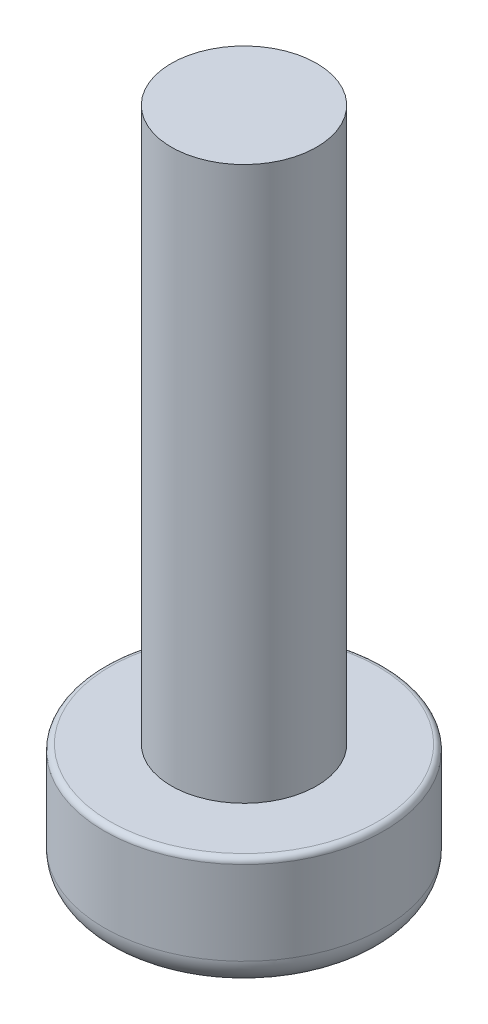
ISO-10303-21;
HEADER;
FILE_DESCRIPTION(('STEP AP214'),'2;1');
FILE_NAME('part.step','',(''),(''),'','','');
FILE_SCHEMA(('AUTOMOTIVE_DESIGN { 1 0 10303 214 1 1 1 1 }'));
ENDSEC;
DATA;
#1=APPLICATION_CONTEXT('core data for automotive mechanical design processes');
#2=APPLICATION_PROTOCOL_DEFINITION('international standard','automotive_design',2000,#1);
#3=PRODUCT_CONTEXT('',#1,'mechanical');
#4=PRODUCT('Part','Part','',(#3));
#5=PRODUCT_RELATED_PRODUCT_CATEGORY('part','',(#4));
#6=PRODUCT_DEFINITION_FORMATION('','',#4);
#7=PRODUCT_DEFINITION_CONTEXT('part definition',#1,'design');
#8=PRODUCT_DEFINITION('design','',#6,#7);
#9=PRODUCT_DEFINITION_SHAPE('','',#8);
#10=(LENGTH_UNIT() NAMED_UNIT(*) SI_UNIT(.MILLI.,.METRE.));
#11=(NAMED_UNIT(*) PLANE_ANGLE_UNIT() SI_UNIT($,.RADIAN.));
#12=(NAMED_UNIT(*) SI_UNIT($,.STERADIAN.) SOLID_ANGLE_UNIT());
#13=UNCERTAINTY_MEASURE_WITH_UNIT(LENGTH_MEASURE(1.E-05),#10,'distance_accuracy_value','');
#14=(GEOMETRIC_REPRESENTATION_CONTEXT(3) GLOBAL_UNCERTAINTY_ASSIGNED_CONTEXT((#13)) GLOBAL_UNIT_ASSIGNED_CONTEXT((#10,
#11,#12)) REPRESENTATION_CONTEXT('',''));
#15=CARTESIAN_POINT('',(0.,0.,0.));
#16=DIRECTION('',(0.,0.,1.));
#17=DIRECTION('',(1.,0.,0.));
#18=AXIS2_PLACEMENT_3D('',#15,#16,#17);
#19=CARTESIAN_POINT('',(0.700775596816466,0.0174321582535849,-0.498474883772021));
#20=DIRECTION('',(0.69906504089404,0.122790460952159,-0.704436350069309));
#21=DIRECTION('',(-0.70980773584202,0.,-0.704395469987439));
#22=AXIS2_PLACEMENT_3D('',#19,#20,#21);
#23=PLANE('',#22);
#24=DIRECTION('',(0.0868265938642476,-0.992432509138967,-0.0868265938642476));
#25=VECTOR('',#24,1.);
#26=CARTESIAN_POINT('',(0.368767004711114,1.5,-0.569525179986132));
#27=LINE('',#26,#25);
#28=CARTESIAN_POINT('',(0.368767004711114,1.5,-0.569525179986132));
#29=VERTEX_POINT('',#28);
#30=CARTESIAN_POINT('',(0.5,0.,-0.700758175275018));
#31=VERTEX_POINT('',#30);
#32=EDGE_CURVE('E168',#29,#31,#27,.T.);
#33=ORIENTED_EDGE('',*,*,#32,.T.);
#34=DIRECTION('',(-0.70980773584202,0.,-0.704395469987439));
#35=VECTOR('',#34,1.);
#36=CARTESIAN_POINT('',(0.702294854053973,0.,-0.500005814315819));
#37=LINE('',#36,#35);
#38=CARTESIAN_POINT('',(0.702300713044445,0.,-0.5));
#39=VERTEX_POINT('',#38);
#40=EDGE_CURVE('E187',#39,#31,#37,.T.);
#41=ORIENTED_EDGE('',*,*,#40,.F.);
#42=DIRECTION('',(-0.0868265938642478,0.992432509138967,0.0868265938642476));
#43=VECTOR('',#42,1.);
#44=CARTESIAN_POINT('',(0.702300713044445,0.,-0.5));
#45=LINE('',#44,#43);
#46=CARTESIAN_POINT('',(0.571067717755559,1.5,-0.368767004711114));
#47=VERTEX_POINT('',#46);
#48=EDGE_CURVE('E170',#39,#47,#45,.T.);
#49=ORIENTED_EDGE('',*,*,#48,.T.);
#50=DIRECTION('',(0.709807735842019,0.,0.70439546998744));
#51=VECTOR('',#50,1.);
#52=CARTESIAN_POINT('',(0.368767004711114,1.5,-0.569525179986132));
#53=LINE('',#52,#51);
#54=EDGE_CURVE('E139',#29,#47,#53,.T.);
#55=ORIENTED_EDGE('',*,*,#54,.F.);
#56=EDGE_LOOP('',(#33,#41,#49,#55));
#57=FACE_BOUND('',#56,.T.);
#58=ADVANCED_FACE('F15',(#57),#23,.F.);
#59=CARTESIAN_POINT('',(0.506013741174089,-0.0687373761551004,0.708314454218533));
#60=DIRECTION('',(0.704436350069309,0.122790460952159,0.69906504089404));
#61=DIRECTION('',(0.70439546998744,0.,-0.70980773584202));
#62=AXIS2_PLACEMENT_3D('',#59,#60,#61);
#63=PLANE('',#62);
#64=DIRECTION('',(0.0868265938642475,-0.992432509138967,0.0868265938642476));
#65=VECTOR('',#64,1.);
#66=CARTESIAN_POINT('',(0.569525179986132,1.5,0.368767004711114));
#67=LINE('',#66,#65);
#68=CARTESIAN_POINT('',(0.569525179986132,1.5,0.368767004711114));
#69=VERTEX_POINT('',#68);
#70=CARTESIAN_POINT('',(0.700758175275018,0.,0.5));
#71=VERTEX_POINT('',#70);
#72=EDGE_CURVE('E295',#69,#71,#67,.T.);
#73=ORIENTED_EDGE('',*,*,#72,.T.);
#74=DIRECTION('',(0.70439546998744,0.,-0.70980773584202));
#75=VECTOR('',#74,1.);
#76=CARTESIAN_POINT('',(0.499977073360182,0.,0.702323815842508));
#77=LINE('',#76,#75);
#78=CARTESIAN_POINT('',(0.5,0.,0.702300713044445));
#79=VERTEX_POINT('',#78);
#80=EDGE_CURVE('E185',#79,#71,#77,.T.);
#81=ORIENTED_EDGE('',*,*,#80,.F.);
#82=DIRECTION('',(-0.0868265938642476,0.992432509138967,-0.0868265938642473));
#83=VECTOR('',#82,1.);
#84=CARTESIAN_POINT('',(0.5,0.,0.702300713044445));
#85=LINE('',#84,#83);
#86=CARTESIAN_POINT('',(0.368767004711114,1.5,0.571067717755559));
#87=VERTEX_POINT('',#86);
#88=EDGE_CURVE('E293',#79,#87,#85,.T.);
#89=ORIENTED_EDGE('',*,*,#88,.T.);
#90=DIRECTION('',(-0.704395469987439,0.,0.70980773584202));
#91=VECTOR('',#90,1.);
#92=CARTESIAN_POINT('',(0.569525179986132,1.5,0.368767004711114));
#93=LINE('',#92,#91);
#94=EDGE_CURVE('E175',#69,#87,#93,.T.);
#95=ORIENTED_EDGE('',*,*,#94,.F.);
#96=EDGE_LOOP('',(#73,#81,#89,#95));
#97=FACE_BOUND('',#96,.T.);
#98=ADVANCED_FACE('F331',(#97),#63,.F.);
#99=CARTESIAN_POINT('',(-0.708314454218531,-0.0687373761551006,0.506013741174088));
#100=DIRECTION('',(-0.699065040894043,0.122790460952159,0.704436350069306));
#101=DIRECTION('',(0.709807735842017,0.,0.704395469987442));
#102=AXIS2_PLACEMENT_3D('',#99,#100,#101);
#103=PLANE('',#102);
#104=DIRECTION('',(-0.0868265938642476,-0.992432509138967,0.0868265938642477));
#105=VECTOR('',#104,1.);
#106=CARTESIAN_POINT('',(-0.368767004711114,1.5,0.569525179986132));
#107=LINE('',#106,#105);
#108=CARTESIAN_POINT('',(-0.368767004711114,1.5,0.569525179986131));
#109=VERTEX_POINT('',#108);
#110=CARTESIAN_POINT('',(-0.5,0.,0.700758175275018));
#111=VERTEX_POINT('',#110);
#112=EDGE_CURVE('E277',#109,#111,#107,.T.);
#113=ORIENTED_EDGE('',*,*,#112,.T.);
#114=DIRECTION('',(0.709807735842017,0.,0.704395469987442));
#115=VECTOR('',#114,1.);
#116=CARTESIAN_POINT('',(-0.702323815842506,0.,0.499977073360182));
#117=LINE('',#116,#115);
#118=CARTESIAN_POINT('',(-0.702300713044443,0.,0.5));
#119=VERTEX_POINT('',#118);
#120=EDGE_CURVE('E183',#119,#111,#117,.T.);
#121=ORIENTED_EDGE('',*,*,#120,.F.);
#122=DIRECTION('',(0.0868265938642478,0.992432509138967,-0.0868265938642476));
#123=VECTOR('',#122,1.);
#124=CARTESIAN_POINT('',(-0.702300713044443,0.,0.5));
#125=LINE('',#124,#123);
#126=CARTESIAN_POINT('',(-0.571067717755557,1.5,0.368767004711114));
#127=VERTEX_POINT('',#126);
#128=EDGE_CURVE('E275',#119,#127,#125,.T.);
#129=ORIENTED_EDGE('',*,*,#128,.T.);
#130=DIRECTION('',(-0.709807735842018,0.,-0.704395469987442));
#131=VECTOR('',#130,1.);
#132=CARTESIAN_POINT('',(-0.368767004711114,1.5,0.569525179986132));
#133=LINE('',#132,#131);
#134=EDGE_CURVE('E157',#109,#127,#133,.T.);
#135=ORIENTED_EDGE('',*,*,#134,.F.);
#136=EDGE_LOOP('',(#113,#121,#129,#135));
#137=FACE_BOUND('',#136,.T.);
#138=ADVANCED_FACE('F382',(#137),#103,.F.);
#139=CARTESIAN_POINT('',(-0.498474883772021,0.0174321582535849,-0.700775596816466));
#140=DIRECTION('',(-0.704436350069309,0.122790460952159,-0.69906504089404));
#141=DIRECTION('',(-0.70439546998744,0.,0.70980773584202));
#142=AXIS2_PLACEMENT_3D('',#139,#140,#141);
#143=PLANE('',#142);
#144=DIRECTION('',(-0.0868265938642476,-0.992432509138967,-0.0868265938642476));
#145=VECTOR('',#144,1.);
#146=CARTESIAN_POINT('',(-0.569525179986132,1.5,-0.368767004711114));
#147=LINE('',#146,#145);
#148=CARTESIAN_POINT('',(-0.569525179986132,1.5,-0.368767004711114));
#149=VERTEX_POINT('',#148);
#150=CARTESIAN_POINT('',(-0.700758175275018,0.,-0.5));
#151=VERTEX_POINT('',#150);
#152=EDGE_CURVE('E259',#149,#151,#147,.T.);
#153=ORIENTED_EDGE('',*,*,#152,.T.);
#154=DIRECTION('',(-0.70439546998744,0.,0.70980773584202));
#155=VECTOR('',#154,1.);
#156=CARTESIAN_POINT('',(-0.500005814315819,0.,-0.702294854053973));
#157=LINE('',#156,#155);
#158=CARTESIAN_POINT('',(-0.5,0.,-0.702300713044445));
#159=VERTEX_POINT('',#158);
#160=EDGE_CURVE('E181',#159,#151,#157,.T.);
#161=ORIENTED_EDGE('',*,*,#160,.F.);
#162=DIRECTION('',(0.0868265938642476,0.992432509138967,0.0868265938642476));
#163=VECTOR('',#162,1.);
#164=CARTESIAN_POINT('',(-0.5,0.,-0.702300713044445));
#165=LINE('',#164,#163);
#166=CARTESIAN_POINT('',(-0.368767004711114,1.5,-0.571067717755559));
#167=VERTEX_POINT('',#166);
#168=EDGE_CURVE('E255',#159,#167,#165,.T.);
#169=ORIENTED_EDGE('',*,*,#168,.T.);
#170=DIRECTION('',(0.704395469987439,0.,-0.70980773584202));
#171=VECTOR('',#170,1.);
#172=CARTESIAN_POINT('',(-0.569525179986132,1.5,-0.368767004711114));
#173=LINE('',#172,#171);
#174=EDGE_CURVE('E179',#149,#167,#173,.T.);
#175=ORIENTED_EDGE('',*,*,#174,.F.);
#176=EDGE_LOOP('',(#153,#161,#169,#175));
#177=FACE_BOUND('',#176,.T.);
#178=ADVANCED_FACE('F559',(#177),#143,.F.);
#179=CARTESIAN_POINT('',(-1.5,1.5,-0.5));
#180=DIRECTION('',(0.,-1.,0.));
#181=DIRECTION('',(0.,0.,-1.));
#182=AXIS2_PLACEMENT_3D('',#179,#180,#181);
#183=PLANE('',#182);
#184=ORIENTED_EDGE('',*,*,#134,.T.);
#185=DIRECTION('',(1.,0.,0.));
#186=VECTOR('',#185,1.);
#187=CARTESIAN_POINT('',(-1.5,1.5,0.368767004711114));
#188=LINE('',#187,#186);
#189=CARTESIAN_POINT('',(-1.36876700471111,1.5,0.368767004711114));
#190=VERTEX_POINT('',#189);
#191=EDGE_CURVE('E273',#127,#190,#188,.F.);
#192=ORIENTED_EDGE('',*,*,#191,.T.);
#193=DIRECTION('',(0.,0.,1.));
#194=VECTOR('',#193,1.);
#195=CARTESIAN_POINT('',(-1.36876700471111,1.5,0.5));
#196=LINE('',#195,#194);
#197=CARTESIAN_POINT('',(-1.36876700471111,1.5,-0.368767004711114));
#198=VERTEX_POINT('',#197);
#199=EDGE_CURVE('E268',#190,#198,#196,.F.);
#200=ORIENTED_EDGE('',*,*,#199,.T.);
#201=DIRECTION('',(1.,0.,0.));
#202=VECTOR('',#201,1.);
#203=CARTESIAN_POINT('',(-1.5,1.5,-0.368767004711114));
#204=LINE('',#203,#202);
#205=EDGE_CURVE('E262',#198,#149,#204,.T.);
#206=ORIENTED_EDGE('',*,*,#205,.T.);
#207=ORIENTED_EDGE('',*,*,#174,.T.);
#208=DIRECTION('',(0.,0.,1.));
#209=VECTOR('',#208,1.);
#210=CARTESIAN_POINT('',(-0.368767004711114,1.5,-0.5));
#211=LINE('',#210,#209);
#212=CARTESIAN_POINT('',(-0.368767004711114,1.5,-1.36876700471111));
#213=VERTEX_POINT('',#212);
#214=EDGE_CURVE('E153',#167,#213,#211,.F.);
#215=ORIENTED_EDGE('',*,*,#214,.T.);
#216=DIRECTION('',(1.,0.,0.));
#217=VECTOR('',#216,1.);
#218=CARTESIAN_POINT('',(-0.5,1.5,-1.36876700471111));
#219=LINE('',#218,#217);
#220=CARTESIAN_POINT('',(0.368767004711114,1.5,-1.36876700471111));
#221=VERTEX_POINT('',#220);
#222=EDGE_CURVE('E144',#213,#221,#219,.T.);
#223=ORIENTED_EDGE('',*,*,#222,.T.);
#224=DIRECTION('',(0.,0.,1.));
#225=VECTOR('',#224,1.);
#226=CARTESIAN_POINT('',(0.368767004711114,1.5,-0.5));
#227=LINE('',#226,#225);
#228=EDGE_CURVE('E149',#221,#29,#227,.T.);
#229=ORIENTED_EDGE('',*,*,#228,.T.);
#230=ORIENTED_EDGE('',*,*,#54,.T.);
#231=DIRECTION('',(1.,0.,0.));
#232=VECTOR('',#231,1.);
#233=CARTESIAN_POINT('',(0.5,1.5,-0.368767004711114));
#234=LINE('',#233,#232);
#235=CARTESIAN_POINT('',(1.36876700471111,1.5,-0.368767004711114));
#236=VERTEX_POINT('',#235);
#237=EDGE_CURVE('E309',#47,#236,#234,.T.);
#238=ORIENTED_EDGE('',*,*,#237,.T.);
#239=DIRECTION('',(0.,0.,1.));
#240=VECTOR('',#239,1.);
#241=CARTESIAN_POINT('',(1.36876700471111,1.5,0.5));
#242=LINE('',#241,#240);
#243=CARTESIAN_POINT('',(1.36876700471111,1.5,0.368767004711114));
#244=VERTEX_POINT('',#243);
#245=EDGE_CURVE('E304',#236,#244,#242,.T.);
#246=ORIENTED_EDGE('',*,*,#245,.T.);
#247=DIRECTION('',(1.,0.,0.));
#248=VECTOR('',#247,1.);
#249=CARTESIAN_POINT('',(0.5,1.5,0.368767004711114));
#250=LINE('',#249,#248);
#251=EDGE_CURVE('E298',#244,#69,#250,.F.);
#252=ORIENTED_EDGE('',*,*,#251,.T.);
#253=ORIENTED_EDGE('',*,*,#94,.T.);
#254=DIRECTION('',(0.,0.,1.));
#255=VECTOR('',#254,1.);
#256=CARTESIAN_POINT('',(0.368767004711114,1.5,1.5));
#257=LINE('',#256,#255);
#258=CARTESIAN_POINT('',(0.368767004711114,1.5,1.36876700471111));
#259=VERTEX_POINT('',#258);
#260=EDGE_CURVE('E291',#87,#259,#257,.T.);
#261=ORIENTED_EDGE('',*,*,#260,.T.);
#262=DIRECTION('',(1.,0.,0.));
#263=VECTOR('',#262,1.);
#264=CARTESIAN_POINT('',(-0.5,1.5,1.36876700471111));
#265=LINE('',#264,#263);
#266=CARTESIAN_POINT('',(-0.368767004711114,1.5,1.36876700471111));
#267=VERTEX_POINT('',#266);
#268=EDGE_CURVE('E286',#259,#267,#265,.F.);
#269=ORIENTED_EDGE('',*,*,#268,.T.);
#270=DIRECTION('',(0.,0.,1.));
#271=VECTOR('',#270,1.);
#272=CARTESIAN_POINT('',(-0.368767004711114,1.5,1.5));
#273=LINE('',#272,#271);
#274=EDGE_CURVE('E280',#267,#109,#273,.F.);
#275=ORIENTED_EDGE('',*,*,#274,.T.);
#276=EDGE_LOOP('',(#184,#192,#200,#206,#207,#215,#223,#229,#230,#238,#246,#252,#253,#261,#269,#275));
#277=FACE_BOUND('',#276,.T.);
#278=ADVANCED_FACE('F147',(#277),#183,.T.);
#279=CARTESIAN_POINT('',(-0.5,0.,-1.5));
#280=DIRECTION('',(0.,0.0871557427476582,-0.996194698091746));
#281=DIRECTION('',(0.,0.996194698091746,0.0871557427476582));
#282=AXIS2_PLACEMENT_3D('',#279,#280,#281);
#283=PLANE('',#282);
#284=DIRECTION('',(-0.0868265938642476,0.992432509138967,0.0868265938642476));
#285=VECTOR('',#284,1.);
#286=CARTESIAN_POINT('',(0.5,0.,-1.5));
#287=LINE('',#286,#285);
#288=CARTESIAN_POINT('',(0.5,0.,-1.5));
#289=VERTEX_POINT('',#288);
#290=EDGE_CURVE('E156',#289,#221,#287,.T.);
#291=ORIENTED_EDGE('',*,*,#290,.T.);
#292=ORIENTED_EDGE('',*,*,#222,.F.);
#293=DIRECTION('',(-0.0868265938642476,-0.992432509138967,-0.0868265938642476));
#294=VECTOR('',#293,1.);
#295=CARTESIAN_POINT('',(-0.368767004711114,1.5,-1.36876700471111));
#296=LINE('',#295,#294);
#297=CARTESIAN_POINT('',(-0.5,0.,-1.5));
#298=VERTEX_POINT('',#297);
#299=EDGE_CURVE('E257',#213,#298,#296,.T.);
#300=ORIENTED_EDGE('',*,*,#299,.T.);
#301=DIRECTION('',(1.,0.,0.));
#302=VECTOR('',#301,1.);
#303=CARTESIAN_POINT('',(0.,0.,-1.5));
#304=LINE('',#303,#302);
#305=EDGE_CURVE('E162',#298,#289,#304,.T.);
#306=ORIENTED_EDGE('',*,*,#305,.T.);
#307=EDGE_LOOP('',(#291,#292,#300,#306));
#308=FACE_BOUND('',#307,.T.);
#309=ADVANCED_FACE('F160',(#308),#283,.F.);
#310=CARTESIAN_POINT('',(0.5,0.,-0.5));
#311=DIRECTION('',(0.996194698091746,0.0871557427476582,0.));
#312=DIRECTION('',(-0.0871557427476582,0.996194698091746,0.));
#313=AXIS2_PLACEMENT_3D('',#310,#311,#312);
#314=PLANE('',#313);
#315=ORIENTED_EDGE('',*,*,#32,.F.);
#316=ORIENTED_EDGE('',*,*,#228,.F.);
#317=ORIENTED_EDGE('',*,*,#290,.F.);
#318=DIRECTION('',(0.,0.,1.));
#319=VECTOR('',#318,1.);
#320=CARTESIAN_POINT('',(0.5,0.,0.));
#321=LINE('',#320,#319);
#322=EDGE_CURVE('E351',#289,#31,#321,.T.);
#323=ORIENTED_EDGE('',*,*,#322,.T.);
#324=EDGE_LOOP('',(#315,#316,#317,#323));
#325=FACE_BOUND('',#324,.T.);
#326=ADVANCED_FACE('F167',(#325),#314,.F.);
#327=CARTESIAN_POINT('',(0.5,0.,-0.5));
#328=DIRECTION('',(0.,0.0871557427476582,-0.996194698091746));
#329=DIRECTION('',(0.,0.996194698091746,0.0871557427476582));
#330=AXIS2_PLACEMENT_3D('',#327,#328,#329);
#331=PLANE('',#330);
#332=ORIENTED_EDGE('',*,*,#48,.F.);
#333=DIRECTION('',(1.,0.,0.));
#334=VECTOR('',#333,1.);
#335=CARTESIAN_POINT('',(0.,0.,-0.5));
#336=LINE('',#335,#334);
#337=CARTESIAN_POINT('',(1.5,0.,-0.5));
#338=VERTEX_POINT('',#337);
#339=EDGE_CURVE('E317',#39,#338,#336,.T.);
#340=ORIENTED_EDGE('',*,*,#339,.T.);
#341=DIRECTION('',(-0.0868265938642476,0.992432509138967,0.0868265938642476));
#342=VECTOR('',#341,1.);
#343=CARTESIAN_POINT('',(1.5,0.,-0.5));
#344=LINE('',#343,#342);
#345=EDGE_CURVE('E306',#338,#236,#344,.T.);
#346=ORIENTED_EDGE('',*,*,#345,.T.);
#347=ORIENTED_EDGE('',*,*,#237,.F.);
#348=EDGE_LOOP('',(#332,#340,#346,#347));
#349=FACE_BOUND('',#348,.T.);
#350=ADVANCED_FACE('F314',(#349),#331,.F.);
#351=CARTESIAN_POINT('',(1.5,0.,0.5));
#352=DIRECTION('',(0.996194698091746,0.0871557427476582,0.));
#353=DIRECTION('',(-0.0871557427476582,0.996194698091746,0.));
#354=AXIS2_PLACEMENT_3D('',#351,#352,#353);
#355=PLANE('',#354);
#356=DIRECTION('',(-0.0868265938642476,0.992432509138967,-0.0868265938642476));
#357=VECTOR('',#356,1.);
#358=CARTESIAN_POINT('',(1.5,0.,0.5));
#359=LINE('',#358,#357);
#360=CARTESIAN_POINT('',(1.5,0.,0.5));
#361=VERTEX_POINT('',#360);
#362=EDGE_CURVE('E301',#361,#244,#359,.T.);
#363=ORIENTED_EDGE('',*,*,#362,.T.);
#364=ORIENTED_EDGE('',*,*,#245,.F.);
#365=ORIENTED_EDGE('',*,*,#345,.F.);
#366=DIRECTION('',(0.,0.,1.));
#367=VECTOR('',#366,1.);
#368=CARTESIAN_POINT('',(1.5,0.,0.));
#369=LINE('',#368,#367);
#370=EDGE_CURVE('E345',#338,#361,#369,.T.);
#371=ORIENTED_EDGE('',*,*,#370,.T.);
#372=EDGE_LOOP('',(#363,#364,#365,#371));
#373=FACE_BOUND('',#372,.T.);
#374=ADVANCED_FACE('F320',(#373),#355,.F.);
#375=CARTESIAN_POINT('',(0.5,0.,0.5));
#376=DIRECTION('',(0.,0.0871557427476582,0.996194698091746));
#377=DIRECTION('',(0.,-0.996194698091746,0.0871557427476582));
#378=AXIS2_PLACEMENT_3D('',#375,#376,#377);
#379=PLANE('',#378);
#380=ORIENTED_EDGE('',*,*,#72,.F.);
#381=ORIENTED_EDGE('',*,*,#251,.F.);
#382=ORIENTED_EDGE('',*,*,#362,.F.);
#383=DIRECTION('',(1.,0.,0.));
#384=VECTOR('',#383,1.);
#385=CARTESIAN_POINT('',(0.,0.,0.5));
#386=LINE('',#385,#384);
#387=EDGE_CURVE('E329',#361,#71,#386,.F.);
#388=ORIENTED_EDGE('',*,*,#387,.T.);
#389=EDGE_LOOP('',(#380,#381,#382,#388));
#390=FACE_BOUND('',#389,.T.);
#391=ADVANCED_FACE('F327',(#390),#379,.F.);
#392=CARTESIAN_POINT('',(0.5,0.,1.5));
#393=DIRECTION('',(0.996194698091746,0.0871557427476582,0.));
#394=DIRECTION('',(-0.0871557427476582,0.996194698091746,0.));
#395=AXIS2_PLACEMENT_3D('',#392,#393,#394);
#396=PLANE('',#395);
#397=ORIENTED_EDGE('',*,*,#88,.F.);
#398=DIRECTION('',(0.,0.,1.));
#399=VECTOR('',#398,1.);
#400=CARTESIAN_POINT('',(0.5,0.,0.));
#401=LINE('',#400,#399);
#402=CARTESIAN_POINT('',(0.5,0.,1.5));
#403=VERTEX_POINT('',#402);
#404=EDGE_CURVE('E336',#79,#403,#401,.T.);
#405=ORIENTED_EDGE('',*,*,#404,.T.);
#406=DIRECTION('',(-0.0868265938642476,0.992432509138967,-0.0868265938642476));
#407=VECTOR('',#406,1.);
#408=CARTESIAN_POINT('',(0.5,0.,1.5));
#409=LINE('',#408,#407);
#410=EDGE_CURVE('E288',#403,#259,#409,.T.);
#411=ORIENTED_EDGE('',*,*,#410,.T.);
#412=ORIENTED_EDGE('',*,*,#260,.F.);
#413=EDGE_LOOP('',(#397,#405,#411,#412));
#414=FACE_BOUND('',#413,.T.);
#415=ADVANCED_FACE('F335',(#414),#396,.F.);
#416=CARTESIAN_POINT('',(-0.5,0.,1.5));
#417=DIRECTION('',(0.,0.0871557427476582,0.996194698091746));
#418=DIRECTION('',(0.,-0.996194698091746,0.0871557427476582));
#419=AXIS2_PLACEMENT_3D('',#416,#417,#418);
#420=PLANE('',#419);
#421=DIRECTION('',(0.0868265938642476,0.992432509138967,-0.0868265938642476));
#422=VECTOR('',#421,1.);
#423=CARTESIAN_POINT('',(-0.5,0.,1.5));
#424=LINE('',#423,#422);
#425=CARTESIAN_POINT('',(-0.5,0.,1.5));
#426=VERTEX_POINT('',#425);
#427=EDGE_CURVE('E283',#426,#267,#424,.T.);
#428=ORIENTED_EDGE('',*,*,#427,.T.);
#429=ORIENTED_EDGE('',*,*,#268,.F.);
#430=ORIENTED_EDGE('',*,*,#410,.F.);
#431=DIRECTION('',(1.,0.,0.));
#432=VECTOR('',#431,1.);
#433=CARTESIAN_POINT('',(0.,0.,1.5));
#434=LINE('',#433,#432);
#435=EDGE_CURVE('E341',#403,#426,#434,.F.);
#436=ORIENTED_EDGE('',*,*,#435,.T.);
#437=EDGE_LOOP('',(#428,#429,#430,#436));
#438=FACE_BOUND('',#437,.T.);
#439=ADVANCED_FACE('F386',(#438),#420,.F.);
#440=CARTESIAN_POINT('',(-0.5,0.,1.5));
#441=DIRECTION('',(-0.996194698091746,0.0871557427476582,0.));
#442=DIRECTION('',(-0.0871557427476582,-0.996194698091746,0.));
#443=AXIS2_PLACEMENT_3D('',#440,#441,#442);
#444=PLANE('',#443);
#445=ORIENTED_EDGE('',*,*,#112,.F.);
#446=ORIENTED_EDGE('',*,*,#274,.F.);
#447=ORIENTED_EDGE('',*,*,#427,.F.);
#448=DIRECTION('',(0.,0.,1.));
#449=VECTOR('',#448,1.);
#450=CARTESIAN_POINT('',(-0.5,0.,0.));
#451=LINE('',#450,#449);
#452=EDGE_CURVE('E343',#426,#111,#451,.F.);
#453=ORIENTED_EDGE('',*,*,#452,.T.);
#454=EDGE_LOOP('',(#445,#446,#447,#453));
#455=FACE_BOUND('',#454,.T.);
#456=ADVANCED_FACE('F376',(#455),#444,.F.);
#457=CARTESIAN_POINT('',(-1.5,0.,0.5));
#458=DIRECTION('',(0.,0.0871557427476582,0.996194698091746));
#459=DIRECTION('',(0.,-0.996194698091746,0.0871557427476582));
#460=AXIS2_PLACEMENT_3D('',#457,#458,#459);
#461=PLANE('',#460);
#462=ORIENTED_EDGE('',*,*,#128,.F.);
#463=DIRECTION('',(1.,0.,0.));
#464=VECTOR('',#463,1.);
#465=CARTESIAN_POINT('',(0.,0.,0.5));
#466=LINE('',#465,#464);
#467=CARTESIAN_POINT('',(-1.5,0.,0.5));
#468=VERTEX_POINT('',#467);
#469=EDGE_CURVE('E371',#119,#468,#466,.F.);
#470=ORIENTED_EDGE('',*,*,#469,.T.);
#471=DIRECTION('',(0.0868265938642476,0.992432509138967,-0.0868265938642476));
#472=VECTOR('',#471,1.);
#473=CARTESIAN_POINT('',(-1.5,0.,0.5));
#474=LINE('',#473,#472);
#475=EDGE_CURVE('E270',#468,#190,#474,.T.);
#476=ORIENTED_EDGE('',*,*,#475,.T.);
#477=ORIENTED_EDGE('',*,*,#191,.F.);
#478=EDGE_LOOP('',(#462,#470,#476,#477));
#479=FACE_BOUND('',#478,.T.);
#480=ADVANCED_FACE('F394',(#479),#461,.F.);
#481=CARTESIAN_POINT('',(-1.5,0.,0.5));
#482=DIRECTION('',(-0.996194698091746,0.0871557427476582,0.));
#483=DIRECTION('',(-0.0871557427476582,-0.996194698091746,0.));
#484=AXIS2_PLACEMENT_3D('',#481,#482,#483);
#485=PLANE('',#484);
#486=DIRECTION('',(0.0868265938642476,0.992432509138967,0.0868265938642476));
#487=VECTOR('',#486,1.);
#488=CARTESIAN_POINT('',(-1.5,0.,-0.5));
#489=LINE('',#488,#487);
#490=CARTESIAN_POINT('',(-1.5,0.,-0.5));
#491=VERTEX_POINT('',#490);
#492=EDGE_CURVE('E265',#491,#198,#489,.T.);
#493=ORIENTED_EDGE('',*,*,#492,.T.);
#494=ORIENTED_EDGE('',*,*,#199,.F.);
#495=ORIENTED_EDGE('',*,*,#475,.F.);
#496=DIRECTION('',(0.,0.,1.));
#497=VECTOR('',#496,1.);
#498=CARTESIAN_POINT('',(-1.5,0.,0.));
#499=LINE('',#498,#497);
#500=EDGE_CURVE('E363',#468,#491,#499,.F.);
#501=ORIENTED_EDGE('',*,*,#500,.T.);
#502=EDGE_LOOP('',(#493,#494,#495,#501));
#503=FACE_BOUND('',#502,.T.);
#504=ADVANCED_FACE('F485',(#503),#485,.F.);
#505=CARTESIAN_POINT('',(-1.5,0.,-0.5));
#506=DIRECTION('',(0.,0.0871557427476582,-0.996194698091746));
#507=DIRECTION('',(0.,0.996194698091746,0.0871557427476582));
#508=AXIS2_PLACEMENT_3D('',#505,#506,#507);
#509=PLANE('',#508);
#510=ORIENTED_EDGE('',*,*,#152,.F.);
#511=ORIENTED_EDGE('',*,*,#205,.F.);
#512=ORIENTED_EDGE('',*,*,#492,.F.);
#513=DIRECTION('',(1.,0.,0.));
#514=VECTOR('',#513,1.);
#515=CARTESIAN_POINT('',(0.,0.,-0.5));
#516=LINE('',#515,#514);
#517=EDGE_CURVE('E359',#491,#151,#516,.T.);
#518=ORIENTED_EDGE('',*,*,#517,.T.);
#519=EDGE_LOOP('',(#510,#511,#512,#518));
#520=FACE_BOUND('',#519,.T.);
#521=ADVANCED_FACE('F478',(#520),#509,.F.);
#522=CARTESIAN_POINT('',(-0.5,0.,-0.5));
#523=DIRECTION('',(-0.996194698091746,0.0871557427476582,0.));
#524=DIRECTION('',(-0.0871557427476582,-0.996194698091746,0.));
#525=AXIS2_PLACEMENT_3D('',#522,#523,#524);
#526=PLANE('',#525);
#527=ORIENTED_EDGE('',*,*,#168,.F.);
#528=DIRECTION('',(0.,0.,1.));
#529=VECTOR('',#528,1.);
#530=CARTESIAN_POINT('',(-0.5,0.,0.));
#531=LINE('',#530,#529);
#532=EDGE_CURVE('E354',#159,#298,#531,.F.);
#533=ORIENTED_EDGE('',*,*,#532,.T.);
#534=ORIENTED_EDGE('',*,*,#299,.F.);
#535=ORIENTED_EDGE('',*,*,#214,.F.);
#536=EDGE_LOOP('',(#527,#533,#534,#535));
#537=FACE_BOUND('',#536,.T.);
#538=ADVANCED_FACE('F470',(#537),#526,.F.);
#539=CARTESIAN_POINT('',(0.,0.,0.));
#540=DIRECTION('',(0.,1.,0.));
#541=DIRECTION('',(0.,0.,1.));
#542=AXIS2_PLACEMENT_3D('',#539,#540,#541);
#543=PLANE('',#542);
#544=CARTESIAN_POINT('',(0.,0.,0.));
#545=DIRECTION('',(0.,1.,0.));
#546=DIRECTION('',(0.,0.,1.));
#547=AXIS2_PLACEMENT_3D('',#544,#545,#546);
#548=CIRCLE('',#547,2.);
#549=CARTESIAN_POINT('',(0.,0.,2.));
#550=VERTEX_POINT('',#549);
#551=CARTESIAN_POINT('',(0.,0.,-2.));
#552=VERTEX_POINT('',#551);
#553=EDGE_CURVE('E358',#550,#552,#548,.T.);
#554=ORIENTED_EDGE('',*,*,#553,.F.);
#555=CARTESIAN_POINT('',(0.,0.,0.));
#556=DIRECTION('',(0.,1.,0.));
#557=DIRECTION('',(0.,0.,-1.));
#558=AXIS2_PLACEMENT_3D('',#555,#556,#557);
#559=CIRCLE('',#558,2.);
#560=EDGE_CURVE('E361',#552,#550,#559,.T.);
#561=ORIENTED_EDGE('',*,*,#560,.F.);
#562=EDGE_LOOP('',(#554,#561));
#563=FACE_BOUND('',#562,.T.);
#564=ORIENTED_EDGE('',*,*,#160,.T.);
#565=ORIENTED_EDGE('',*,*,#517,.F.);
#566=ORIENTED_EDGE('',*,*,#500,.F.);
#567=ORIENTED_EDGE('',*,*,#469,.F.);
#568=ORIENTED_EDGE('',*,*,#120,.T.);
#569=ORIENTED_EDGE('',*,*,#452,.F.);
#570=ORIENTED_EDGE('',*,*,#435,.F.);
#571=ORIENTED_EDGE('',*,*,#404,.F.);
#572=ORIENTED_EDGE('',*,*,#80,.T.);
#573=ORIENTED_EDGE('',*,*,#387,.F.);
#574=ORIENTED_EDGE('',*,*,#370,.F.);
#575=ORIENTED_EDGE('',*,*,#339,.F.);
#576=ORIENTED_EDGE('',*,*,#40,.T.);
#577=ORIENTED_EDGE('',*,*,#322,.F.);
#578=ORIENTED_EDGE('',*,*,#305,.F.);
#579=ORIENTED_EDGE('',*,*,#532,.F.);
#580=EDGE_LOOP('',(#564,#565,#566,#567,#568,#569,#570,#571,#572,#573,#574,#575,#576,#577,#578,#579));
#581=FACE_BOUND('',#580,.T.);
#582=ADVANCED_FACE('F237',(#563,#581),#543,.F.);
#583=CARTESIAN_POINT('',(0.,0.5,0.));
#584=DIRECTION('',(0.,1.,0.));
#585=DIRECTION('',(0.,0.,1.));
#586=AXIS2_PLACEMENT_3D('',#583,#584,#585);
#587=TOROIDAL_SURFACE('',#586,2.,0.5);
#588=ORIENTED_EDGE('',*,*,#553,.T.);
#589=ORIENTED_EDGE('',*,*,#560,.T.);
#590=EDGE_LOOP('',(#588,#589));
#591=FACE_BOUND('',#590,.T.);
#592=CARTESIAN_POINT('',(0.,0.5,0.));
#593=DIRECTION('',(0.,-1.,0.));
#594=DIRECTION('',(0.,0.,-1.));
#595=AXIS2_PLACEMENT_3D('',#592,#593,#594);
#596=CIRCLE('',#595,2.5);
#597=CARTESIAN_POINT('',(0.,0.5,-2.5));
#598=VERTEX_POINT('',#597);
#599=EDGE_CURVE('E229',#598,#598,#596,.F.);
#600=ORIENTED_EDGE('',*,*,#599,.F.);
#601=EDGE_LOOP('',(#600));
#602=FACE_BOUND('',#601,.T.);
#603=ADVANCED_FACE('F233',(#591,#602),#587,.T.);
#604=CARTESIAN_POINT('',(0.,2.1,0.));
#605=DIRECTION('',(0.,-1.,0.));
#606=DIRECTION('',(0.,0.,-1.));
#607=AXIS2_PLACEMENT_3D('',#604,#605,#606);
#608=CYLINDRICAL_SURFACE('',#607,2.5);
#609=CARTESIAN_POINT('',(0.,2.,0.));
#610=DIRECTION('',(0.,1.,0.));
#611=DIRECTION('',(0.,0.,1.));
#612=AXIS2_PLACEMENT_3D('',#609,#610,#611);
#613=CIRCLE('',#612,2.5);
#614=CARTESIAN_POINT('',(0.,2.,2.5));
#615=VERTEX_POINT('',#614);
#616=EDGE_CURVE('E221',#615,#615,#613,.T.);
#617=ORIENTED_EDGE('',*,*,#616,.F.);
#618=EDGE_LOOP('',(#617));
#619=FACE_BOUND('',#618,.T.);
#620=ORIENTED_EDGE('',*,*,#599,.T.);
#621=EDGE_LOOP('',(#620));
#622=FACE_BOUND('',#621,.T.);
#623=ADVANCED_FACE('F208',(#619,#622),#608,.T.);
#624=CARTESIAN_POINT('',(0.,2.,0.));
#625=DIRECTION('',(0.,1.,0.));
#626=DIRECTION('',(0.,0.,1.));
#627=AXIS2_PLACEMENT_3D('',#624,#625,#626);
#628=TOROIDAL_SURFACE('',#627,2.4,0.1);
#629=ORIENTED_EDGE('',*,*,#616,.T.);
#630=EDGE_LOOP('',(#629));
#631=FACE_BOUND('',#630,.T.);
#632=CARTESIAN_POINT('',(0.,2.1,0.));
#633=DIRECTION('',(0.,-1.,0.));
#634=DIRECTION('',(0.,0.,1.));
#635=AXIS2_PLACEMENT_3D('',#632,#633,#634);
#636=CIRCLE('',#635,2.4);
#637=CARTESIAN_POINT('',(0.,2.1,-2.4));
#638=VERTEX_POINT('',#637);
#639=CARTESIAN_POINT('',(0.,2.1,2.4));
#640=VERTEX_POINT('',#639);
#641=EDGE_CURVE('E34',#638,#640,#636,.F.);
#642=ORIENTED_EDGE('',*,*,#641,.F.);
#643=CARTESIAN_POINT('',(0.,2.1,0.));
#644=DIRECTION('',(0.,-1.,0.));
#645=DIRECTION('',(0.,0.,-1.));
#646=AXIS2_PLACEMENT_3D('',#643,#644,#645);
#647=CIRCLE('',#646,2.4);
#648=EDGE_CURVE('E192',#640,#638,#647,.F.);
#649=ORIENTED_EDGE('',*,*,#648,.F.);
#650=EDGE_LOOP('',(#642,#649));
#651=FACE_BOUND('',#650,.T.);
#652=ADVANCED_FACE('F196',(#631,#651),#628,.T.);
#653=CARTESIAN_POINT('',(0.,12.,0.));
#654=DIRECTION('',(0.,1.,0.));
#655=DIRECTION('',(0.,0.,1.));
#656=AXIS2_PLACEMENT_3D('',#653,#654,#655);
#657=PLANE('',#656);
#658=CARTESIAN_POINT('',(0.,12.,0.));
#659=DIRECTION('',(0.,-1.,0.));
#660=DIRECTION('',(0.,0.,-1.));
#661=AXIS2_PLACEMENT_3D('',#658,#659,#660);
#662=CIRCLE('',#661,1.3);
#663=CARTESIAN_POINT('',(0.,12.,-1.3));
#664=VERTEX_POINT('',#663);
#665=EDGE_CURVE('E26',#664,#664,#662,.T.);
#666=ORIENTED_EDGE('',*,*,#665,.F.);
#667=EDGE_LOOP('',(#666));
#668=FACE_BOUND('',#667,.T.);
#669=ADVANCED_FACE('F207',(#668),#657,.T.);
#670=CARTESIAN_POINT('',(0.,2.1,0.));
#671=DIRECTION('',(0.,1.,0.));
#672=DIRECTION('',(0.,0.,1.));
#673=AXIS2_PLACEMENT_3D('',#670,#671,#672);
#674=PLANE('',#673);
#675=CARTESIAN_POINT('',(0.,2.1,0.));
#676=DIRECTION('',(0.,-1.,0.));
#677=DIRECTION('',(0.,0.,-1.));
#678=AXIS2_PLACEMENT_3D('',#675,#676,#677);
#679=CIRCLE('',#678,1.3);
#680=CARTESIAN_POINT('',(0.,2.1,-1.3));
#681=VERTEX_POINT('',#680);
#682=EDGE_CURVE('E10',#681,#681,#679,.F.);
#683=ORIENTED_EDGE('',*,*,#682,.F.);
#684=EDGE_LOOP('',(#683));
#685=FACE_BOUND('',#684,.T.);
#686=ORIENTED_EDGE('',*,*,#648,.T.);
#687=ORIENTED_EDGE('',*,*,#641,.T.);
#688=EDGE_LOOP('',(#686,#687));
#689=FACE_BOUND('',#688,.T.);
#690=ADVANCED_FACE('F399',(#685,#689),#674,.T.);
#691=CARTESIAN_POINT('',(0.,12.,0.));
#692=DIRECTION('',(0.,-1.,0.));
#693=DIRECTION('',(0.,0.,-1.));
#694=AXIS2_PLACEMENT_3D('',#691,#692,#693);
#695=CYLINDRICAL_SURFACE('',#694,1.3);
#696=ORIENTED_EDGE('',*,*,#682,.T.);
#697=EDGE_LOOP('',(#696));
#698=FACE_BOUND('',#697,.T.);
#699=ORIENTED_EDGE('',*,*,#665,.T.);
#700=EDGE_LOOP('',(#699));
#701=FACE_BOUND('',#700,.T.);
#702=ADVANCED_FACE('F397',(#698,#701),#695,.T.);
#703=CLOSED_SHELL('',(#58,#98,#138,#178,#278,#309,#326,#350,#374,#391,#415,#439,#456,#480,#504,
#521,#538,#582,#603,#623,#652,#669,#690,#702));
#704=MANIFOLD_SOLID_BREP('B1',#703);
#705=ADVANCED_BREP_SHAPE_REPRESENTATION('',(#18,#704),#14);
#706=SHAPE_DEFINITION_REPRESENTATION(#9,#705);
ENDSEC;
END-ISO-10303-21;
